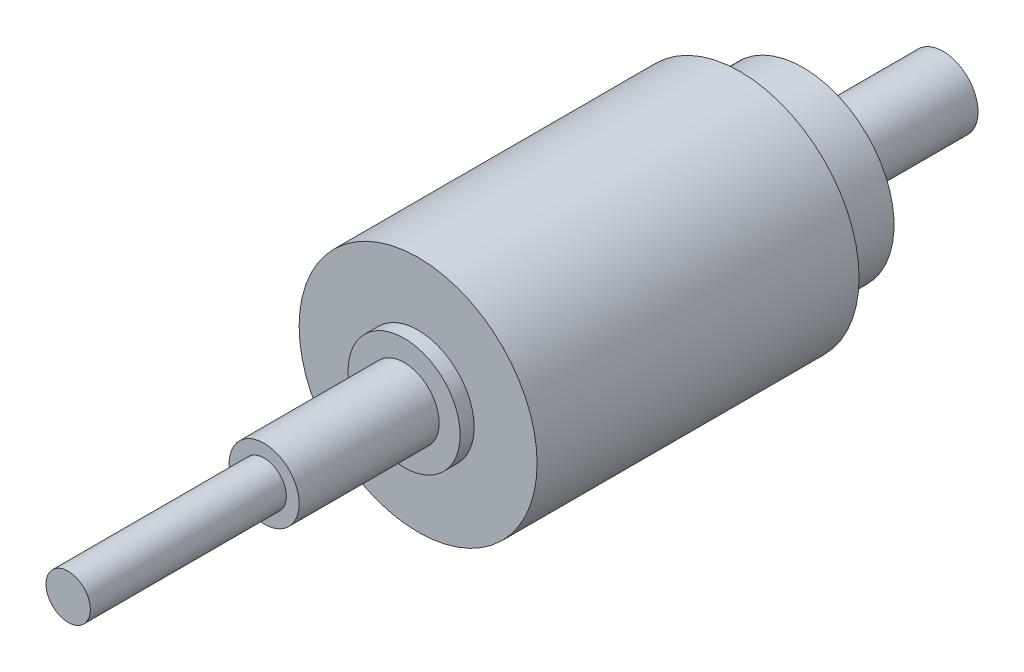
ISO-10303-21;
HEADER;
FILE_DESCRIPTION(('STEP AP214'),'2;1');
FILE_NAME('part.step','',(''),(''),'','','');
FILE_SCHEMA(('AUTOMOTIVE_DESIGN { 1 0 10303 214 1 1 1 1 }'));
ENDSEC;
DATA;
#1=APPLICATION_CONTEXT('core data for automotive mechanical design processes');
#2=APPLICATION_PROTOCOL_DEFINITION('international standard','automotive_design',2000,#1);
#3=PRODUCT_CONTEXT('',#1,'mechanical');
#4=PRODUCT('Part','Part','',(#3));
#5=PRODUCT_RELATED_PRODUCT_CATEGORY('part','',(#4));
#6=PRODUCT_DEFINITION_FORMATION('','',#4);
#7=PRODUCT_DEFINITION_CONTEXT('part definition',#1,'design');
#8=PRODUCT_DEFINITION('design','',#6,#7);
#9=PRODUCT_DEFINITION_SHAPE('','',#8);
#10=(LENGTH_UNIT() NAMED_UNIT(*) SI_UNIT(.MILLI.,.METRE.));
#11=(NAMED_UNIT(*) PLANE_ANGLE_UNIT() SI_UNIT($,.RADIAN.));
#12=(NAMED_UNIT(*) SI_UNIT($,.STERADIAN.) SOLID_ANGLE_UNIT());
#13=UNCERTAINTY_MEASURE_WITH_UNIT(LENGTH_MEASURE(1.E-05),#10,'distance_accuracy_value','');
#14=(GEOMETRIC_REPRESENTATION_CONTEXT(3) GLOBAL_UNCERTAINTY_ASSIGNED_CONTEXT((#13)) GLOBAL_UNIT_ASSIGNED_CONTEXT((#10,
#11,#12)) REPRESENTATION_CONTEXT('',''));
#15=CARTESIAN_POINT('',(0.,0.,0.));
#16=DIRECTION('',(0.,0.,1.));
#17=DIRECTION('',(1.,0.,0.));
#18=AXIS2_PLACEMENT_3D('',#15,#16,#17);
#19=CARTESIAN_POINT('',(0.,0.,23.));
#20=DIRECTION('',(0.,0.,-1.));
#21=DIRECTION('',(-1.,0.,0.));
#22=AXIS2_PLACEMENT_3D('',#19,#20,#21);
#23=CYLINDRICAL_SURFACE('',#22,8.5);
#24=CARTESIAN_POINT('',(0.,0.,23.));
#25=DIRECTION('',(0.,0.,1.));
#26=DIRECTION('',(1.,0.,0.));
#27=AXIS2_PLACEMENT_3D('',#24,#25,#26);
#28=CIRCLE('',#27,8.5);
#29=CARTESIAN_POINT('',(8.5,0.,23.));
#30=VERTEX_POINT('',#29);
#31=EDGE_CURVE('E74',#30,#30,#28,.T.);
#32=ORIENTED_EDGE('',*,*,#31,.F.);
#33=EDGE_LOOP('',(#32));
#34=FACE_BOUND('',#33,.T.);
#35=CARTESIAN_POINT('',(0.,0.,0.));
#36=DIRECTION('',(0.,0.,1.));
#37=DIRECTION('',(1.,0.,0.));
#38=AXIS2_PLACEMENT_3D('',#35,#36,#37);
#39=CIRCLE('',#38,8.5);
#40=CARTESIAN_POINT('',(8.5,0.,0.));
#41=VERTEX_POINT('',#40);
#42=EDGE_CURVE('E41',#41,#41,#39,.T.);
#43=ORIENTED_EDGE('',*,*,#42,.T.);
#44=EDGE_LOOP('',(#43));
#45=FACE_BOUND('',#44,.T.);
#46=ADVANCED_FACE('F38',(#34,#45),#23,.T.);
#47=CARTESIAN_POINT('',(0.,0.,23.));
#48=DIRECTION('',(0.,0.,1.));
#49=DIRECTION('',(1.,0.,0.));
#50=AXIS2_PLACEMENT_3D('',#47,#48,#49);
#51=PLANE('',#50);
#52=CARTESIAN_POINT('',(0.,0.,23.));
#53=DIRECTION('',(0.,0.,1.));
#54=DIRECTION('',(1.,0.,0.));
#55=AXIS2_PLACEMENT_3D('',#52,#53,#54);
#56=CIRCLE('',#55,4.);
#57=CARTESIAN_POINT('',(4.,0.,23.));
#58=VERTEX_POINT('',#57);
#59=EDGE_CURVE('E70',#58,#58,#56,.T.);
#60=ORIENTED_EDGE('',*,*,#59,.F.);
#61=EDGE_LOOP('',(#60));
#62=FACE_BOUND('',#61,.T.);
#63=ORIENTED_EDGE('',*,*,#31,.T.);
#64=EDGE_LOOP('',(#63));
#65=FACE_BOUND('',#64,.T.);
#66=ADVANCED_FACE('F85',(#62,#65),#51,.T.);
#67=CARTESIAN_POINT('',(0.,0.,0.));
#68=DIRECTION('',(0.,0.,1.));
#69=DIRECTION('',(1.,0.,0.));
#70=AXIS2_PLACEMENT_3D('',#67,#68,#69);
#71=PLANE('',#70);
#72=CARTESIAN_POINT('',(0.,0.,0.));
#73=DIRECTION('',(0.,0.,-1.));
#74=DIRECTION('',(-1.,0.,0.));
#75=AXIS2_PLACEMENT_3D('',#72,#73,#74);
#76=CIRCLE('',#75,6.5);
#77=CARTESIAN_POINT('',(-6.5,0.,0.));
#78=VERTEX_POINT('',#77);
#79=EDGE_CURVE('E50',#78,#78,#76,.T.);
#80=ORIENTED_EDGE('',*,*,#79,.F.);
#81=EDGE_LOOP('',(#80));
#82=FACE_BOUND('',#81,.T.);
#83=ORIENTED_EDGE('',*,*,#42,.F.);
#84=EDGE_LOOP('',(#83));
#85=FACE_BOUND('',#84,.T.);
#86=ADVANCED_FACE('F82',(#82,#85),#71,.F.);
#87=CARTESIAN_POINT('',(0.,0.,24.));
#88=DIRECTION('',(0.,0.,-1.));
#89=DIRECTION('',(-1.,0.,0.));
#90=AXIS2_PLACEMENT_3D('',#87,#88,#89);
#91=CYLINDRICAL_SURFACE('',#90,4.);
#92=CARTESIAN_POINT('',(0.,0.,24.));
#93=DIRECTION('',(0.,0.,1.));
#94=DIRECTION('',(1.,0.,0.));
#95=AXIS2_PLACEMENT_3D('',#92,#93,#94);
#96=CIRCLE('',#95,4.);
#97=CARTESIAN_POINT('',(4.,0.,24.));
#98=VERTEX_POINT('',#97);
#99=EDGE_CURVE('E67',#98,#98,#96,.T.);
#100=ORIENTED_EDGE('',*,*,#99,.F.);
#101=EDGE_LOOP('',(#100));
#102=FACE_BOUND('',#101,.T.);
#103=ORIENTED_EDGE('',*,*,#59,.T.);
#104=EDGE_LOOP('',(#103));
#105=FACE_BOUND('',#104,.T.);
#106=ADVANCED_FACE('F84',(#102,#105),#91,.T.);
#107=CARTESIAN_POINT('',(0.,0.,24.));
#108=DIRECTION('',(0.,0.,1.));
#109=DIRECTION('',(1.,0.,0.));
#110=AXIS2_PLACEMENT_3D('',#107,#108,#109);
#111=PLANE('',#110);
#112=CARTESIAN_POINT('',(0.,0.,24.));
#113=DIRECTION('',(0.,0.,1.));
#114=DIRECTION('',(1.,0.,0.));
#115=AXIS2_PLACEMENT_3D('',#112,#113,#114);
#116=CIRCLE('',#115,2.5);
#117=CARTESIAN_POINT('',(2.5,0.,24.));
#118=VERTEX_POINT('',#117);
#119=EDGE_CURVE('E64',#118,#118,#116,.T.);
#120=ORIENTED_EDGE('',*,*,#119,.F.);
#121=EDGE_LOOP('',(#120));
#122=FACE_BOUND('',#121,.T.);
#123=ORIENTED_EDGE('',*,*,#99,.T.);
#124=EDGE_LOOP('',(#123));
#125=FACE_BOUND('',#124,.T.);
#126=ADVANCED_FACE('F91',(#122,#125),#111,.T.);
#127=CARTESIAN_POINT('',(0.,0.,34.));
#128=DIRECTION('',(0.,0.,-1.));
#129=DIRECTION('',(-1.,0.,0.));
#130=AXIS2_PLACEMENT_3D('',#127,#128,#129);
#131=CYLINDRICAL_SURFACE('',#130,2.5);
#132=CARTESIAN_POINT('',(0.,0.,34.));
#133=DIRECTION('',(0.,0.,1.));
#134=DIRECTION('',(1.,0.,0.));
#135=AXIS2_PLACEMENT_3D('',#132,#133,#134);
#136=CIRCLE('',#135,2.5);
#137=CARTESIAN_POINT('',(2.5,0.,34.));
#138=VERTEX_POINT('',#137);
#139=EDGE_CURVE('E61',#138,#138,#136,.T.);
#140=ORIENTED_EDGE('',*,*,#139,.F.);
#141=EDGE_LOOP('',(#140));
#142=FACE_BOUND('',#141,.T.);
#143=ORIENTED_EDGE('',*,*,#119,.T.);
#144=EDGE_LOOP('',(#143));
#145=FACE_BOUND('',#144,.T.);
#146=ADVANCED_FACE('F125',(#142,#145),#131,.T.);
#147=CARTESIAN_POINT('',(0.,0.,34.));
#148=DIRECTION('',(0.,0.,1.));
#149=DIRECTION('',(1.,0.,0.));
#150=AXIS2_PLACEMENT_3D('',#147,#148,#149);
#151=PLANE('',#150);
#152=CARTESIAN_POINT('',(0.,0.,34.));
#153=DIRECTION('',(0.,0.,1.));
#154=DIRECTION('',(1.,0.,0.));
#155=AXIS2_PLACEMENT_3D('',#152,#153,#154);
#156=CIRCLE('',#155,1.585);
#157=CARTESIAN_POINT('',(1.585,0.,34.));
#158=VERTEX_POINT('',#157);
#159=EDGE_CURVE('E10',#158,#158,#156,.T.);
#160=ORIENTED_EDGE('',*,*,#159,.F.);
#161=EDGE_LOOP('',(#160));
#162=FACE_BOUND('',#161,.T.);
#163=ORIENTED_EDGE('',*,*,#139,.T.);
#164=EDGE_LOOP('',(#163));
#165=FACE_BOUND('',#164,.T.);
#166=ADVANCED_FACE('F135',(#162,#165),#151,.T.);
#167=CARTESIAN_POINT('',(0.,0.,-4.5));
#168=DIRECTION('',(0.,0.,1.));
#169=DIRECTION('',(1.,0.,0.));
#170=AXIS2_PLACEMENT_3D('',#167,#168,#169);
#171=CYLINDRICAL_SURFACE('',#170,6.5);
#172=CARTESIAN_POINT('',(0.,0.,-4.5));
#173=DIRECTION('',(0.,0.,-1.));
#174=DIRECTION('',(-1.,0.,0.));
#175=AXIS2_PLACEMENT_3D('',#172,#173,#174);
#176=CIRCLE('',#175,6.5);
#177=CARTESIAN_POINT('',(-6.5,0.,-4.5));
#178=VERTEX_POINT('',#177);
#179=EDGE_CURVE('E57',#178,#178,#176,.T.);
#180=ORIENTED_EDGE('',*,*,#179,.F.);
#181=EDGE_LOOP('',(#180));
#182=FACE_BOUND('',#181,.T.);
#183=ORIENTED_EDGE('',*,*,#79,.T.);
#184=EDGE_LOOP('',(#183));
#185=FACE_BOUND('',#184,.T.);
#186=ADVANCED_FACE('F149',(#182,#185),#171,.T.);
#187=CARTESIAN_POINT('',(0.,0.,-4.5));
#188=DIRECTION('',(0.,0.,-1.));
#189=DIRECTION('',(-1.,0.,0.));
#190=AXIS2_PLACEMENT_3D('',#187,#188,#189);
#191=PLANE('',#190);
#192=CARTESIAN_POINT('',(0.,0.,-4.5));
#193=DIRECTION('',(0.,0.,-1.));
#194=DIRECTION('',(-1.,0.,0.));
#195=AXIS2_PLACEMENT_3D('',#192,#193,#194);
#196=CIRCLE('',#195,2.5);
#197=CARTESIAN_POINT('',(-2.5,0.,-4.5));
#198=VERTEX_POINT('',#197);
#199=EDGE_CURVE('E45',#198,#198,#196,.T.);
#200=ORIENTED_EDGE('',*,*,#199,.F.);
#201=EDGE_LOOP('',(#200));
#202=FACE_BOUND('',#201,.T.);
#203=ORIENTED_EDGE('',*,*,#179,.T.);
#204=EDGE_LOOP('',(#203));
#205=FACE_BOUND('',#204,.T.);
#206=ADVANCED_FACE('F154',(#202,#205),#191,.T.);
#207=CARTESIAN_POINT('',(0.,0.,-14.5));
#208=DIRECTION('',(0.,0.,1.));
#209=DIRECTION('',(1.,0.,0.));
#210=AXIS2_PLACEMENT_3D('',#207,#208,#209);
#211=CYLINDRICAL_SURFACE('',#210,2.5);
#212=CARTESIAN_POINT('',(0.,0.,-14.5));
#213=DIRECTION('',(0.,0.,-1.));
#214=DIRECTION('',(-1.,0.,0.));
#215=AXIS2_PLACEMENT_3D('',#212,#213,#214);
#216=CIRCLE('',#215,2.5);
#217=CARTESIAN_POINT('',(-2.5,0.,-14.5));
#218=VERTEX_POINT('',#217);
#219=EDGE_CURVE('E55',#218,#218,#216,.T.);
#220=ORIENTED_EDGE('',*,*,#219,.F.);
#221=EDGE_LOOP('',(#220));
#222=FACE_BOUND('',#221,.T.);
#223=ORIENTED_EDGE('',*,*,#199,.T.);
#224=EDGE_LOOP('',(#223));
#225=FACE_BOUND('',#224,.T.);
#226=ADVANCED_FACE('F165',(#222,#225),#211,.T.);
#227=CARTESIAN_POINT('',(0.,0.,-14.5));
#228=DIRECTION('',(0.,0.,-1.));
#229=DIRECTION('',(-1.,0.,0.));
#230=AXIS2_PLACEMENT_3D('',#227,#228,#229);
#231=PLANE('',#230);
#232=ORIENTED_EDGE('',*,*,#219,.T.);
#233=EDGE_LOOP('',(#232));
#234=FACE_BOUND('',#233,.T.);
#235=ADVANCED_FACE('F176',(#234),#231,.T.);
#236=CARTESIAN_POINT('',(0.,0.,48.));
#237=DIRECTION('',(0.,0.,-1.));
#238=DIRECTION('',(-1.,0.,0.));
#239=AXIS2_PLACEMENT_3D('',#236,#237,#238);
#240=CYLINDRICAL_SURFACE('',#239,1.585);
#241=CARTESIAN_POINT('',(0.,0.,48.));
#242=DIRECTION('',(0.,0.,1.));
#243=DIRECTION('',(1.,0.,0.));
#244=AXIS2_PLACEMENT_3D('',#241,#242,#243);
#245=CIRCLE('',#244,1.585);
#246=CARTESIAN_POINT('',(1.585,0.,48.));
#247=VERTEX_POINT('',#246);
#248=EDGE_CURVE('E54',#247,#247,#245,.T.);
#249=ORIENTED_EDGE('',*,*,#248,.F.);
#250=EDGE_LOOP('',(#249));
#251=FACE_BOUND('',#250,.T.);
#252=ORIENTED_EDGE('',*,*,#159,.T.);
#253=EDGE_LOOP('',(#252));
#254=FACE_BOUND('',#253,.T.);
#255=ADVANCED_FACE('F187',(#251,#254),#240,.T.);
#256=CARTESIAN_POINT('',(0.,0.,48.));
#257=DIRECTION('',(0.,0.,1.));
#258=DIRECTION('',(1.,0.,0.));
#259=AXIS2_PLACEMENT_3D('',#256,#257,#258);
#260=PLANE('',#259);
#261=ORIENTED_EDGE('',*,*,#248,.T.);
#262=EDGE_LOOP('',(#261));
#263=FACE_BOUND('',#262,.T.);
#264=ADVANCED_FACE('F206',(#263),#260,.T.);
#265=CLOSED_SHELL('',(#46,#66,#86,#106,#126,#146,#166,#186,#206,#226,#235,#255,#264));
#266=MANIFOLD_SOLID_BREP('B2',#265);
#267=ADVANCED_BREP_SHAPE_REPRESENTATION('',(#18,#266),#14);
#268=SHAPE_DEFINITION_REPRESENTATION(#9,#267);
ENDSEC;
END-ISO-10303-21;
